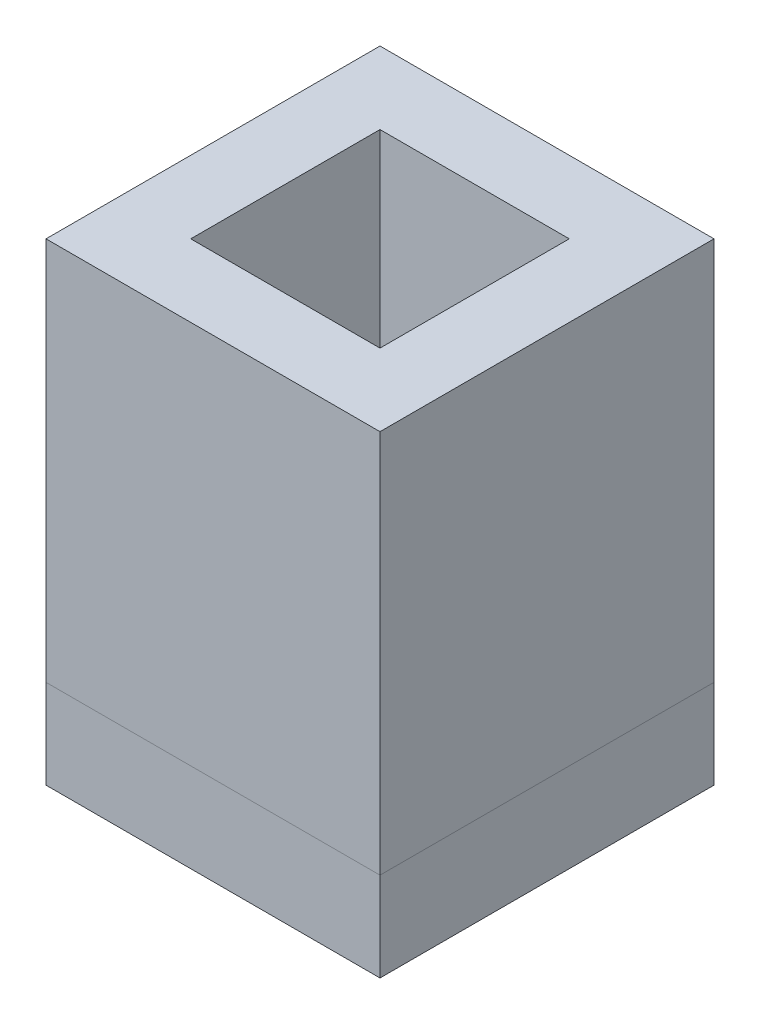
ISO-10303-21;
HEADER;
FILE_DESCRIPTION(('STEP AP214'),'2;1');
FILE_NAME('part.step','',(''),(''),'','','');
FILE_SCHEMA(('AUTOMOTIVE_DESIGN { 1 0 10303 214 1 1 1 1 }'));
ENDSEC;
DATA;
#1=APPLICATION_CONTEXT('core data for automotive mechanical design processes');
#2=APPLICATION_PROTOCOL_DEFINITION('international standard','automotive_design',2000,#1);
#3=PRODUCT_CONTEXT('',#1,'mechanical');
#4=PRODUCT('Part','Part','',(#3));
#5=PRODUCT_RELATED_PRODUCT_CATEGORY('part','',(#4));
#6=PRODUCT_DEFINITION_FORMATION('','',#4);
#7=PRODUCT_DEFINITION_CONTEXT('part definition',#1,'design');
#8=PRODUCT_DEFINITION('design','',#6,#7);
#9=PRODUCT_DEFINITION_SHAPE('','',#8);
#10=(LENGTH_UNIT() NAMED_UNIT(*) SI_UNIT(.MILLI.,.METRE.));
#11=(NAMED_UNIT(*) PLANE_ANGLE_UNIT() SI_UNIT($,.RADIAN.));
#12=(NAMED_UNIT(*) SI_UNIT($,.STERADIAN.) SOLID_ANGLE_UNIT());
#13=UNCERTAINTY_MEASURE_WITH_UNIT(LENGTH_MEASURE(1.E-05),#10,'distance_accuracy_value','');
#14=(GEOMETRIC_REPRESENTATION_CONTEXT(3) GLOBAL_UNCERTAINTY_ASSIGNED_CONTEXT((#13)) GLOBAL_UNIT_ASSIGNED_CONTEXT((#10,
#11,#12)) REPRESENTATION_CONTEXT('',''));
#15=CARTESIAN_POINT('',(0.,0.,0.));
#16=DIRECTION('',(0.,0.,1.));
#17=DIRECTION('',(1.,0.,0.));
#18=AXIS2_PLACEMENT_3D('',#15,#16,#17);
#19=CARTESIAN_POINT('',(0.,425.,0.));
#20=DIRECTION('',(0.,-1.,0.));
#21=DIRECTION('',(0.,0.,-1.));
#22=AXIS2_PLACEMENT_3D('',#19,#20,#21);
#23=PLANE('',#22);
#24=DIRECTION('',(0.,0.,-1.));
#25=VECTOR('',#24,1.);
#26=CARTESIAN_POINT('',(150.,425.,150.));
#27=LINE('',#26,#25);
#28=CARTESIAN_POINT('',(150.,425.,150.));
#29=VERTEX_POINT('',#28);
#30=CARTESIAN_POINT('',(150.,425.,-150.));
#31=VERTEX_POINT('',#30);
#32=EDGE_CURVE('E158',#29,#31,#27,.T.);
#33=ORIENTED_EDGE('',*,*,#32,.T.);
#34=DIRECTION('',(-1.,0.,0.));
#35=VECTOR('',#34,1.);
#36=CARTESIAN_POINT('',(-150.,425.,-150.));
#37=LINE('',#36,#35);
#38=CARTESIAN_POINT('',(-150.,425.,-150.));
#39=VERTEX_POINT('',#38);
#40=EDGE_CURVE('E161',#31,#39,#37,.T.);
#41=ORIENTED_EDGE('',*,*,#40,.T.);
#42=DIRECTION('',(0.,0.,1.));
#43=VECTOR('',#42,1.);
#44=CARTESIAN_POINT('',(-150.,425.,150.));
#45=LINE('',#44,#43);
#46=CARTESIAN_POINT('',(-150.,425.,150.));
#47=VERTEX_POINT('',#46);
#48=EDGE_CURVE('E164',#39,#47,#45,.T.);
#49=ORIENTED_EDGE('',*,*,#48,.T.);
#50=DIRECTION('',(1.,0.,0.));
#51=VECTOR('',#50,1.);
#52=CARTESIAN_POINT('',(-150.,425.,150.));
#53=LINE('',#52,#51);
#54=EDGE_CURVE('E166',#47,#29,#53,.T.);
#55=ORIENTED_EDGE('',*,*,#54,.T.);
#56=EDGE_LOOP('',(#33,#41,#49,#55));
#57=FACE_BOUND('',#56,.T.);
#58=DIRECTION('',(0.,0.,-1.));
#59=VECTOR('',#58,1.);
#60=CARTESIAN_POINT('',(85.,425.,85.));
#61=LINE('',#60,#59);
#62=CARTESIAN_POINT('',(85.,425.,85.));
#63=VERTEX_POINT('',#62);
#64=CARTESIAN_POINT('',(85.,425.,-85.));
#65=VERTEX_POINT('',#64);
#66=EDGE_CURVE('E117',#63,#65,#61,.T.);
#67=ORIENTED_EDGE('',*,*,#66,.F.);
#68=DIRECTION('',(1.,0.,0.));
#69=VECTOR('',#68,1.);
#70=CARTESIAN_POINT('',(-85.,425.,85.));
#71=LINE('',#70,#69);
#72=CARTESIAN_POINT('',(-85.,425.,85.));
#73=VERTEX_POINT('',#72);
#74=EDGE_CURVE('E140',#73,#63,#71,.T.);
#75=ORIENTED_EDGE('',*,*,#74,.F.);
#76=DIRECTION('',(0.,0.,1.));
#77=VECTOR('',#76,1.);
#78=CARTESIAN_POINT('',(-85.,425.,85.));
#79=LINE('',#78,#77);
#80=CARTESIAN_POINT('',(-85.,425.,-85.));
#81=VERTEX_POINT('',#80);
#82=EDGE_CURVE('E138',#81,#73,#79,.T.);
#83=ORIENTED_EDGE('',*,*,#82,.F.);
#84=DIRECTION('',(-1.,0.,0.));
#85=VECTOR('',#84,1.);
#86=CARTESIAN_POINT('',(-85.,425.,-85.));
#87=LINE('',#86,#85);
#88=EDGE_CURVE('E125',#65,#81,#87,.T.);
#89=ORIENTED_EDGE('',*,*,#88,.F.);
#90=EDGE_LOOP('',(#67,#75,#83,#89));
#91=FACE_BOUND('',#90,.T.);
#92=ADVANCED_FACE('F51',(#57,#91),#23,.F.);
#93=CARTESIAN_POINT('',(0.,80.,0.));
#94=DIRECTION('',(0.,-1.,0.));
#95=DIRECTION('',(0.,0.,-1.));
#96=AXIS2_PLACEMENT_3D('',#93,#94,#95);
#97=PLANE('',#96);
#98=DIRECTION('',(0.,0.,-1.));
#99=VECTOR('',#98,1.);
#100=CARTESIAN_POINT('',(150.,80.,150.));
#101=LINE('',#100,#99);
#102=CARTESIAN_POINT('',(150.,80.,150.));
#103=VERTEX_POINT('',#102);
#104=CARTESIAN_POINT('',(150.,80.,-150.));
#105=VERTEX_POINT('',#104);
#106=EDGE_CURVE('E134',#103,#105,#101,.T.);
#107=ORIENTED_EDGE('',*,*,#106,.F.);
#108=DIRECTION('',(1.,0.,0.));
#109=VECTOR('',#108,1.);
#110=CARTESIAN_POINT('',(-150.,80.,150.));
#111=LINE('',#110,#109);
#112=CARTESIAN_POINT('',(-150.,80.,150.));
#113=VERTEX_POINT('',#112);
#114=EDGE_CURVE('E162',#113,#103,#111,.T.);
#115=ORIENTED_EDGE('',*,*,#114,.F.);
#116=DIRECTION('',(0.,0.,1.));
#117=VECTOR('',#116,1.);
#118=CARTESIAN_POINT('',(-150.,80.,150.));
#119=LINE('',#118,#117);
#120=CARTESIAN_POINT('',(-150.,80.,-150.));
#121=VERTEX_POINT('',#120);
#122=EDGE_CURVE('E174',#121,#113,#119,.T.);
#123=ORIENTED_EDGE('',*,*,#122,.F.);
#124=DIRECTION('',(-1.,0.,0.));
#125=VECTOR('',#124,1.);
#126=CARTESIAN_POINT('',(-150.,80.,-150.));
#127=LINE('',#126,#125);
#128=EDGE_CURVE('E171',#105,#121,#127,.T.);
#129=ORIENTED_EDGE('',*,*,#128,.F.);
#130=EDGE_LOOP('',(#107,#115,#123,#129));
#131=FACE_BOUND('',#130,.T.);
#132=DIRECTION('',(1.,0.,0.));
#133=VECTOR('',#132,1.);
#134=CARTESIAN_POINT('',(-85.,80.,85.));
#135=LINE('',#134,#133);
#136=CARTESIAN_POINT('',(-85.,80.,85.));
#137=VERTEX_POINT('',#136);
#138=CARTESIAN_POINT('',(85.,80.,85.));
#139=VERTEX_POINT('',#138);
#140=EDGE_CURVE('E126',#137,#139,#135,.T.);
#141=ORIENTED_EDGE('',*,*,#140,.T.);
#142=DIRECTION('',(0.,0.,-1.));
#143=VECTOR('',#142,1.);
#144=CARTESIAN_POINT('',(85.,80.,85.));
#145=LINE('',#144,#143);
#146=CARTESIAN_POINT('',(85.,80.,-85.));
#147=VERTEX_POINT('',#146);
#148=EDGE_CURVE('E74',#139,#147,#145,.T.);
#149=ORIENTED_EDGE('',*,*,#148,.T.);
#150=DIRECTION('',(-1.,0.,0.));
#151=VECTOR('',#150,1.);
#152=CARTESIAN_POINT('',(-85.,80.,-85.));
#153=LINE('',#152,#151);
#154=CARTESIAN_POINT('',(-85.,80.,-85.));
#155=VERTEX_POINT('',#154);
#156=EDGE_CURVE('E132',#147,#155,#153,.T.);
#157=ORIENTED_EDGE('',*,*,#156,.T.);
#158=DIRECTION('',(0.,0.,1.));
#159=VECTOR('',#158,1.);
#160=CARTESIAN_POINT('',(-85.,80.,85.));
#161=LINE('',#160,#159);
#162=EDGE_CURVE('E147',#155,#137,#161,.T.);
#163=ORIENTED_EDGE('',*,*,#162,.T.);
#164=EDGE_LOOP('',(#141,#149,#157,#163));
#165=FACE_BOUND('',#164,.T.);
#166=ADVANCED_FACE('F196',(#131,#165),#97,.T.);
#167=CARTESIAN_POINT('',(150.,425.,150.));
#168=DIRECTION('',(-1.,0.,0.));
#169=DIRECTION('',(0.,0.,1.));
#170=AXIS2_PLACEMENT_3D('',#167,#168,#169);
#171=PLANE('',#170);
#172=ORIENTED_EDGE('',*,*,#106,.T.);
#173=DIRECTION('',(0.,-1.,0.));
#174=VECTOR('',#173,1.);
#175=CARTESIAN_POINT('',(150.,425.,-150.));
#176=LINE('',#175,#174);
#177=EDGE_CURVE('E12',#31,#105,#176,.T.);
#178=ORIENTED_EDGE('',*,*,#177,.F.);
#179=ORIENTED_EDGE('',*,*,#32,.F.);
#180=DIRECTION('',(0.,-1.,0.));
#181=VECTOR('',#180,1.);
#182=CARTESIAN_POINT('',(150.,425.,150.));
#183=LINE('',#182,#181);
#184=EDGE_CURVE('E168',#29,#103,#183,.T.);
#185=ORIENTED_EDGE('',*,*,#184,.T.);
#186=EDGE_LOOP('',(#172,#178,#179,#185));
#187=FACE_BOUND('',#186,.T.);
#188=ADVANCED_FACE('F53',(#187),#171,.F.);
#189=CARTESIAN_POINT('',(-150.,425.,-150.));
#190=DIRECTION('',(0.,0.,1.));
#191=DIRECTION('',(1.,0.,0.));
#192=AXIS2_PLACEMENT_3D('',#189,#190,#191);
#193=PLANE('',#192);
#194=ORIENTED_EDGE('',*,*,#128,.T.);
#195=DIRECTION('',(0.,-1.,0.));
#196=VECTOR('',#195,1.);
#197=CARTESIAN_POINT('',(-150.,425.,-150.));
#198=LINE('',#197,#196);
#199=EDGE_CURVE('E59',#39,#121,#198,.T.);
#200=ORIENTED_EDGE('',*,*,#199,.F.);
#201=ORIENTED_EDGE('',*,*,#40,.F.);
#202=ORIENTED_EDGE('',*,*,#177,.T.);
#203=EDGE_LOOP('',(#194,#200,#201,#202));
#204=FACE_BOUND('',#203,.T.);
#205=ADVANCED_FACE('F206',(#204),#193,.F.);
#206=CARTESIAN_POINT('',(-150.,425.,150.));
#207=DIRECTION('',(1.,0.,0.));
#208=DIRECTION('',(0.,0.,-1.));
#209=AXIS2_PLACEMENT_3D('',#206,#207,#208);
#210=PLANE('',#209);
#211=ORIENTED_EDGE('',*,*,#122,.T.);
#212=DIRECTION('',(0.,-1.,0.));
#213=VECTOR('',#212,1.);
#214=CARTESIAN_POINT('',(-150.,425.,150.));
#215=LINE('',#214,#213);
#216=EDGE_CURVE('E181',#47,#113,#215,.T.);
#217=ORIENTED_EDGE('',*,*,#216,.F.);
#218=ORIENTED_EDGE('',*,*,#48,.F.);
#219=ORIENTED_EDGE('',*,*,#199,.T.);
#220=EDGE_LOOP('',(#211,#217,#218,#219));
#221=FACE_BOUND('',#220,.T.);
#222=ADVANCED_FACE('F190',(#221),#210,.F.);
#223=CARTESIAN_POINT('',(-150.,425.,150.));
#224=DIRECTION('',(0.,0.,-1.));
#225=DIRECTION('',(-1.,0.,0.));
#226=AXIS2_PLACEMENT_3D('',#223,#224,#225);
#227=PLANE('',#226);
#228=ORIENTED_EDGE('',*,*,#114,.T.);
#229=ORIENTED_EDGE('',*,*,#184,.F.);
#230=ORIENTED_EDGE('',*,*,#54,.F.);
#231=ORIENTED_EDGE('',*,*,#216,.T.);
#232=EDGE_LOOP('',(#228,#229,#230,#231));
#233=FACE_BOUND('',#232,.T.);
#234=ADVANCED_FACE('F200',(#233),#227,.F.);
#235=CARTESIAN_POINT('',(85.,425.,85.));
#236=DIRECTION('',(-1.,0.,0.));
#237=DIRECTION('',(0.,0.,1.));
#238=AXIS2_PLACEMENT_3D('',#235,#236,#237);
#239=PLANE('',#238);
#240=ORIENTED_EDGE('',*,*,#148,.F.);
#241=DIRECTION('',(0.,-1.,0.));
#242=VECTOR('',#241,1.);
#243=CARTESIAN_POINT('',(85.,425.,85.));
#244=LINE('',#243,#242);
#245=EDGE_CURVE('E121',#63,#139,#244,.T.);
#246=ORIENTED_EDGE('',*,*,#245,.F.);
#247=ORIENTED_EDGE('',*,*,#66,.T.);
#248=DIRECTION('',(0.,-1.,0.));
#249=VECTOR('',#248,1.);
#250=CARTESIAN_POINT('',(85.,425.,-85.));
#251=LINE('',#250,#249);
#252=EDGE_CURVE('E120',#65,#147,#251,.T.);
#253=ORIENTED_EDGE('',*,*,#252,.T.);
#254=EDGE_LOOP('',(#240,#246,#247,#253));
#255=FACE_BOUND('',#254,.T.);
#256=ADVANCED_FACE('F119',(#255),#239,.T.);
#257=CARTESIAN_POINT('',(-85.,425.,-85.));
#258=DIRECTION('',(0.,0.,1.));
#259=DIRECTION('',(1.,0.,0.));
#260=AXIS2_PLACEMENT_3D('',#257,#258,#259);
#261=PLANE('',#260);
#262=ORIENTED_EDGE('',*,*,#156,.F.);
#263=ORIENTED_EDGE('',*,*,#252,.F.);
#264=ORIENTED_EDGE('',*,*,#88,.T.);
#265=DIRECTION('',(0.,-1.,0.));
#266=VECTOR('',#265,1.);
#267=CARTESIAN_POINT('',(-85.,425.,-85.));
#268=LINE('',#267,#266);
#269=EDGE_CURVE('E135',#81,#155,#268,.T.);
#270=ORIENTED_EDGE('',*,*,#269,.T.);
#271=EDGE_LOOP('',(#262,#263,#264,#270));
#272=FACE_BOUND('',#271,.T.);
#273=ADVANCED_FACE('F129',(#272),#261,.T.);
#274=CARTESIAN_POINT('',(-85.,425.,85.));
#275=DIRECTION('',(1.,0.,0.));
#276=DIRECTION('',(0.,0.,-1.));
#277=AXIS2_PLACEMENT_3D('',#274,#275,#276);
#278=PLANE('',#277);
#279=ORIENTED_EDGE('',*,*,#162,.F.);
#280=ORIENTED_EDGE('',*,*,#269,.F.);
#281=ORIENTED_EDGE('',*,*,#82,.T.);
#282=DIRECTION('',(0.,-1.,0.));
#283=VECTOR('',#282,1.);
#284=CARTESIAN_POINT('',(-85.,425.,85.));
#285=LINE('',#284,#283);
#286=EDGE_CURVE('E66',#73,#137,#285,.T.);
#287=ORIENTED_EDGE('',*,*,#286,.T.);
#288=EDGE_LOOP('',(#279,#280,#281,#287));
#289=FACE_BOUND('',#288,.T.);
#290=ADVANCED_FACE('F229',(#289),#278,.T.);
#291=CARTESIAN_POINT('',(-85.,425.,85.));
#292=DIRECTION('',(0.,0.,-1.));
#293=DIRECTION('',(-1.,0.,0.));
#294=AXIS2_PLACEMENT_3D('',#291,#292,#293);
#295=PLANE('',#294);
#296=ORIENTED_EDGE('',*,*,#140,.F.);
#297=ORIENTED_EDGE('',*,*,#286,.F.);
#298=ORIENTED_EDGE('',*,*,#74,.T.);
#299=ORIENTED_EDGE('',*,*,#245,.T.);
#300=EDGE_LOOP('',(#296,#297,#298,#299));
#301=FACE_BOUND('',#300,.T.);
#302=ADVANCED_FACE('F233',(#301),#295,.T.);
#303=CLOSED_SHELL('',(#92,#166,#188,#205,#222,#234,#256,#273,#290,#302));
#304=MANIFOLD_SOLID_BREP('B2',#303);
#305=CARTESIAN_POINT('',(150.,80.,150.));
#306=DIRECTION('',(-1.,0.,0.));
#307=DIRECTION('',(0.,0.,1.));
#308=AXIS2_PLACEMENT_3D('',#305,#306,#307);
#309=PLANE('',#308);
#310=DIRECTION('',(0.,0.,-1.));
#311=VECTOR('',#310,1.);
#312=CARTESIAN_POINT('',(150.,0.,150.));
#313=LINE('',#312,#311);
#314=CARTESIAN_POINT('',(150.,0.,150.));
#315=VERTEX_POINT('',#314);
#316=CARTESIAN_POINT('',(150.,0.,-150.));
#317=VERTEX_POINT('',#316);
#318=EDGE_CURVE('E366',#315,#317,#313,.T.);
#319=ORIENTED_EDGE('',*,*,#318,.T.);
#320=DIRECTION('',(0.,-1.,0.));
#321=VECTOR('',#320,1.);
#322=CARTESIAN_POINT('',(150.,80.,-150.));
#323=LINE('',#322,#321);
#324=CARTESIAN_POINT('',(150.,80.,-150.));
#325=VERTEX_POINT('',#324);
#326=EDGE_CURVE('E49',#325,#317,#323,.T.);
#327=ORIENTED_EDGE('',*,*,#326,.F.);
#328=DIRECTION('',(0.,0.,-1.));
#329=VECTOR('',#328,1.);
#330=CARTESIAN_POINT('',(150.,80.,150.));
#331=LINE('',#330,#329);
#332=CARTESIAN_POINT('',(150.,80.,150.));
#333=VERTEX_POINT('',#332);
#334=EDGE_CURVE('E351',#333,#325,#331,.T.);
#335=ORIENTED_EDGE('',*,*,#334,.F.);
#336=DIRECTION('',(0.,-1.,0.));
#337=VECTOR('',#336,1.);
#338=CARTESIAN_POINT('',(150.,80.,150.));
#339=LINE('',#338,#337);
#340=EDGE_CURVE('E362',#333,#315,#339,.T.);
#341=ORIENTED_EDGE('',*,*,#340,.T.);
#342=EDGE_LOOP('',(#319,#327,#335,#341));
#343=FACE_BOUND('',#342,.T.);
#344=ADVANCED_FACE('F299',(#343),#309,.F.);
#345=CARTESIAN_POINT('',(-150.,80.,-150.));
#346=DIRECTION('',(0.,0.,1.));
#347=DIRECTION('',(1.,0.,0.));
#348=AXIS2_PLACEMENT_3D('',#345,#346,#347);
#349=PLANE('',#348);
#350=DIRECTION('',(-1.,0.,0.));
#351=VECTOR('',#350,1.);
#352=CARTESIAN_POINT('',(-150.,0.,-150.));
#353=LINE('',#352,#351);
#354=CARTESIAN_POINT('',(-150.,0.,-150.));
#355=VERTEX_POINT('',#354);
#356=EDGE_CURVE('E356',#317,#355,#353,.T.);
#357=ORIENTED_EDGE('',*,*,#356,.T.);
#358=DIRECTION('',(0.,-1.,0.));
#359=VECTOR('',#358,1.);
#360=CARTESIAN_POINT('',(-150.,80.,-150.));
#361=LINE('',#360,#359);
#362=CARTESIAN_POINT('',(-150.,80.,-150.));
#363=VERTEX_POINT('',#362);
#364=EDGE_CURVE('E307',#363,#355,#361,.T.);
#365=ORIENTED_EDGE('',*,*,#364,.F.);
#366=DIRECTION('',(-1.,0.,0.));
#367=VECTOR('',#366,1.);
#368=CARTESIAN_POINT('',(-150.,80.,-150.));
#369=LINE('',#368,#367);
#370=EDGE_CURVE('E345',#325,#363,#369,.T.);
#371=ORIENTED_EDGE('',*,*,#370,.F.);
#372=ORIENTED_EDGE('',*,*,#326,.T.);
#373=EDGE_LOOP('',(#357,#365,#371,#372));
#374=FACE_BOUND('',#373,.T.);
#375=ADVANCED_FACE('F355',(#374),#349,.F.);
#376=CARTESIAN_POINT('',(-150.,80.,150.));
#377=DIRECTION('',(1.,0.,0.));
#378=DIRECTION('',(0.,0.,-1.));
#379=AXIS2_PLACEMENT_3D('',#376,#377,#378);
#380=PLANE('',#379);
#381=DIRECTION('',(0.,0.,1.));
#382=VECTOR('',#381,1.);
#383=CARTESIAN_POINT('',(-150.,0.,150.));
#384=LINE('',#383,#382);
#385=CARTESIAN_POINT('',(-150.,0.,150.));
#386=VERTEX_POINT('',#385);
#387=EDGE_CURVE('E332',#355,#386,#384,.T.);
#388=ORIENTED_EDGE('',*,*,#387,.T.);
#389=DIRECTION('',(0.,-1.,0.));
#390=VECTOR('',#389,1.);
#391=CARTESIAN_POINT('',(-150.,80.,150.));
#392=LINE('',#391,#390);
#393=CARTESIAN_POINT('',(-150.,80.,150.));
#394=VERTEX_POINT('',#393);
#395=EDGE_CURVE('E358',#394,#386,#392,.T.);
#396=ORIENTED_EDGE('',*,*,#395,.F.);
#397=DIRECTION('',(0.,0.,1.));
#398=VECTOR('',#397,1.);
#399=CARTESIAN_POINT('',(-150.,80.,150.));
#400=LINE('',#399,#398);
#401=EDGE_CURVE('E349',#363,#394,#400,.T.);
#402=ORIENTED_EDGE('',*,*,#401,.F.);
#403=ORIENTED_EDGE('',*,*,#364,.T.);
#404=EDGE_LOOP('',(#388,#396,#402,#403));
#405=FACE_BOUND('',#404,.T.);
#406=ADVANCED_FACE('F359',(#405),#380,.F.);
#407=CARTESIAN_POINT('',(-150.,80.,150.));
#408=DIRECTION('',(0.,0.,-1.));
#409=DIRECTION('',(-1.,0.,0.));
#410=AXIS2_PLACEMENT_3D('',#407,#408,#409);
#411=PLANE('',#410);
#412=DIRECTION('',(1.,0.,0.));
#413=VECTOR('',#412,1.);
#414=CARTESIAN_POINT('',(-150.,0.,150.));
#415=LINE('',#414,#413);
#416=EDGE_CURVE('E338',#386,#315,#415,.T.);
#417=ORIENTED_EDGE('',*,*,#416,.T.);
#418=ORIENTED_EDGE('',*,*,#340,.F.);
#419=DIRECTION('',(1.,0.,0.));
#420=VECTOR('',#419,1.);
#421=CARTESIAN_POINT('',(-150.,80.,150.));
#422=LINE('',#421,#420);
#423=EDGE_CURVE('E315',#394,#333,#422,.T.);
#424=ORIENTED_EDGE('',*,*,#423,.F.);
#425=ORIENTED_EDGE('',*,*,#395,.T.);
#426=EDGE_LOOP('',(#417,#418,#424,#425));
#427=FACE_BOUND('',#426,.T.);
#428=ADVANCED_FACE('F374',(#427),#411,.F.);
#429=CARTESIAN_POINT('',(0.,80.,0.));
#430=DIRECTION('',(0.,-1.,0.));
#431=DIRECTION('',(0.,0.,-1.));
#432=AXIS2_PLACEMENT_3D('',#429,#430,#431);
#433=PLANE('',#432);
#434=ORIENTED_EDGE('',*,*,#334,.T.);
#435=ORIENTED_EDGE('',*,*,#370,.T.);
#436=ORIENTED_EDGE('',*,*,#401,.T.);
#437=ORIENTED_EDGE('',*,*,#423,.T.);
#438=EDGE_LOOP('',(#434,#435,#436,#437));
#439=FACE_BOUND('',#438,.T.);
#440=ADVANCED_FACE('F347',(#439),#433,.F.);
#441=CARTESIAN_POINT('',(0.,0.,0.));
#442=DIRECTION('',(0.,-1.,0.));
#443=DIRECTION('',(0.,0.,-1.));
#444=AXIS2_PLACEMENT_3D('',#441,#442,#443);
#445=PLANE('',#444);
#446=ORIENTED_EDGE('',*,*,#318,.F.);
#447=ORIENTED_EDGE('',*,*,#416,.F.);
#448=ORIENTED_EDGE('',*,*,#387,.F.);
#449=ORIENTED_EDGE('',*,*,#356,.F.);
#450=EDGE_LOOP('',(#446,#447,#448,#449));
#451=FACE_BOUND('',#450,.T.);
#452=ADVANCED_FACE('F377',(#451),#445,.T.);
#453=CLOSED_SHELL('',(#344,#375,#406,#428,#440,#452));
#454=MANIFOLD_SOLID_BREP('B6',#453);
#455=ADVANCED_BREP_SHAPE_REPRESENTATION('',(#18,#304,#454),#14);
#456=SHAPE_DEFINITION_REPRESENTATION(#9,#455);
ENDSEC;
END-ISO-10303-21;
